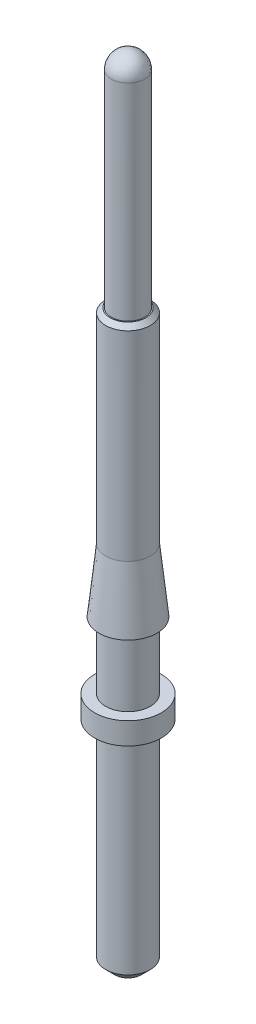
ISO-10303-21;
HEADER;
FILE_DESCRIPTION(('STEP AP214'),'2;1');
FILE_NAME('part.step','',(''),(''),'','','');
FILE_SCHEMA(('AUTOMOTIVE_DESIGN { 1 0 10303 214 1 1 1 1 }'));
ENDSEC;
DATA;
#1=APPLICATION_CONTEXT('core data for automotive mechanical design processes');
#2=APPLICATION_PROTOCOL_DEFINITION('international standard','automotive_design',2000,#1);
#3=PRODUCT_CONTEXT('',#1,'mechanical');
#4=PRODUCT('Part','Part','',(#3));
#5=PRODUCT_RELATED_PRODUCT_CATEGORY('part','',(#4));
#6=PRODUCT_DEFINITION_FORMATION('','',#4);
#7=PRODUCT_DEFINITION_CONTEXT('part definition',#1,'design');
#8=PRODUCT_DEFINITION('design','',#6,#7);
#9=PRODUCT_DEFINITION_SHAPE('','',#8);
#10=(LENGTH_UNIT() NAMED_UNIT(*) SI_UNIT(.MILLI.,.METRE.));
#11=(NAMED_UNIT(*) PLANE_ANGLE_UNIT() SI_UNIT($,.RADIAN.));
#12=(NAMED_UNIT(*) SI_UNIT($,.STERADIAN.) SOLID_ANGLE_UNIT());
#13=UNCERTAINTY_MEASURE_WITH_UNIT(LENGTH_MEASURE(1.E-05),#10,'distance_accuracy_value','');
#14=(GEOMETRIC_REPRESENTATION_CONTEXT(3) GLOBAL_UNCERTAINTY_ASSIGNED_CONTEXT((#13)) GLOBAL_UNIT_ASSIGNED_CONTEXT((#10,
#11,#12)) REPRESENTATION_CONTEXT('',''));
#15=CARTESIAN_POINT('',(0.,0.,0.));
#16=DIRECTION('',(0.,0.,1.));
#17=DIRECTION('',(1.,0.,0.));
#18=AXIS2_PLACEMENT_3D('',#15,#16,#17);
#19=CARTESIAN_POINT('',(0.,8.86,0.000500000000000093));
#20=DIRECTION('',(1.,0.,0.));
#21=DIRECTION('',(0.,0.,1.));
#22=AXIS2_PLACEMENT_3D('',#19,#20,#21);
#23=CIRCLE('',#22,0.19);
#24=TRIMMED_CURVE('',#23,(PARAMETER_VALUE(-1.57342790877965)),
(PARAMETER_VALUE(1.57342790877965)),.T.,.PARAMETER.);
#25=CARTESIAN_POINT('',(0.,8.86,0.));
#26=DIRECTION('',(0.,1.,0.));
#27=AXIS1_PLACEMENT('',#25,#26);
#28=SURFACE_OF_REVOLUTION('',#24,#27);
#29=CARTESIAN_POINT('',(0.,8.86,0.));
#30=DIRECTION('',(0.,-1.,0.));
#31=DIRECTION('',(0.,0.,-1.));
#32=AXIS2_PLACEMENT_3D('',#29,#30,#31);
#33=CIRCLE('',#32,0.1905);
#34=CARTESIAN_POINT('',(0.,8.86,-0.1905));
#35=VERTEX_POINT('',#34);
#36=EDGE_CURVE('E101',#35,#35,#33,.T.);
#37=ORIENTED_EDGE('',*,*,#36,.F.);
#38=EDGE_LOOP('',(#37));
#39=FACE_BOUND('',#38,.T.);
#40=CARTESIAN_POINT('',(0.,9.05,0.));
#41=VERTEX_POINT('',#40);
#42=VERTEX_LOOP('',#41);
#43=FACE_BOUND('',#42,.T.);
#44=ADVANCED_FACE('F17',(#39,#43),#28,.F.);
#45=CARTESIAN_POINT('',(0.,-0.868296699884766,0.));
#46=DIRECTION('',(0.,-1.,0.));
#47=DIRECTION('',(0.,0.,-1.));
#48=AXIS2_PLACEMENT_3D('',#45,#46,#47);
#49=CYLINDRICAL_SURFACE('',#48,0.1905);
#50=ORIENTED_EDGE('',*,*,#36,.T.);
#51=EDGE_LOOP('',(#50));
#52=FACE_BOUND('',#51,.T.);
#53=CARTESIAN_POINT('',(0.,6.51,0.));
#54=DIRECTION('',(0.,-1.,0.));
#55=DIRECTION('',(0.,0.,-1.));
#56=AXIS2_PLACEMENT_3D('',#53,#54,#55);
#57=CIRCLE('',#56,0.1905);
#58=CARTESIAN_POINT('',(0.,6.51,-0.1905));
#59=VERTEX_POINT('',#58);
#60=EDGE_CURVE('E21',#59,#59,#57,.T.);
#61=ORIENTED_EDGE('',*,*,#60,.F.);
#62=EDGE_LOOP('',(#61));
#63=FACE_BOUND('',#62,.T.);
#64=ADVANCED_FACE('F30',(#52,#63),#49,.T.);
#65=CARTESIAN_POINT('',(0.1905,6.51,0.));
#66=DIRECTION('',(0.,1.,0.));
#67=DIRECTION('',(0.,0.,1.));
#68=AXIS2_PLACEMENT_3D('',#65,#66,#67);
#69=PLANE('',#68);
#70=ORIENTED_EDGE('',*,*,#60,.T.);
#71=EDGE_LOOP('',(#70));
#72=FACE_BOUND('',#71,.T.);
#73=CARTESIAN_POINT('',(0.,6.50999999999158,0.));
#74=DIRECTION('',(0.,-1.,0.));
#75=DIRECTION('',(1.,0.,0.));
#76=AXIS2_PLACEMENT_3D('',#73,#74,#75);
#77=CIRCLE('',#76,0.203200000044035);
#78=CARTESIAN_POINT('',(0.203200000044035,6.50999999999158,0.));
#79=VERTEX_POINT('',#78);
#80=EDGE_CURVE('E96',#79,#79,#77,.T.);
#81=ORIENTED_EDGE('',*,*,#80,.F.);
#82=EDGE_LOOP('',(#81));
#83=FACE_BOUND('',#82,.T.);
#84=ADVANCED_FACE('F36',(#72,#83),#69,.T.);
#85=CARTESIAN_POINT('',(0.,6.45920000005162,0.));
#86=DIRECTION('',(0.,-1.,0.));
#87=DIRECTION('',(1.,0.,0.));
#88=AXIS2_PLACEMENT_3D('',#85,#86,#87);
#89=CONICAL_SURFACE('',#88,0.253999999927146,0.785398162837966);
#90=ORIENTED_EDGE('',*,*,#80,.T.);
#91=EDGE_LOOP('',(#90));
#92=FACE_BOUND('',#91,.T.);
#93=CARTESIAN_POINT('',(0.,6.4592,0.));
#94=DIRECTION('',(0.,-1.,0.));
#95=DIRECTION('',(0.,0.,-1.));
#96=AXIS2_PLACEMENT_3D('',#93,#94,#95);
#97=CIRCLE('',#96,0.254000000000002);
#98=CARTESIAN_POINT('',(0.,6.4592,-0.254000000000002));
#99=VERTEX_POINT('',#98);
#100=EDGE_CURVE('E97',#99,#99,#97,.T.);
#101=ORIENTED_EDGE('',*,*,#100,.F.);
#102=EDGE_LOOP('',(#101));
#103=FACE_BOUND('',#102,.T.);
#104=ADVANCED_FACE('F82',(#92,#103),#89,.T.);
#105=CARTESIAN_POINT('',(0.,-0.868296699884766,0.));
#106=DIRECTION('',(0.,-1.,0.));
#107=DIRECTION('',(0.,0.,-1.));
#108=AXIS2_PLACEMENT_3D('',#105,#106,#107);
#109=CYLINDRICAL_SURFACE('',#108,0.254000000000002);
#110=ORIENTED_EDGE('',*,*,#100,.T.);
#111=EDGE_LOOP('',(#110));
#112=FACE_BOUND('',#111,.T.);
#113=CARTESIAN_POINT('',(0.,4.18309169850772,0.));
#114=DIRECTION('',(0.,-1.,0.));
#115=DIRECTION('',(0.,0.,-1.));
#116=AXIS2_PLACEMENT_3D('',#113,#114,#115);
#117=CIRCLE('',#116,0.2539999999982);
#118=CARTESIAN_POINT('',(0.,4.18309169850772,-0.2539999999982));
#119=VERTEX_POINT('',#118);
#120=EDGE_CURVE('E99',#119,#119,#117,.T.);
#121=ORIENTED_EDGE('',*,*,#120,.F.);
#122=EDGE_LOOP('',(#121));
#123=FACE_BOUND('',#122,.T.);
#124=ADVANCED_FACE('F78',(#112,#123),#109,.T.);
#125=CARTESIAN_POINT('',(0.,3.46000000001823,0.));
#126=DIRECTION('',(0.,-1.,0.));
#127=DIRECTION('',(0.,0.,-1.));
#128=AXIS2_PLACEMENT_3D('',#125,#126,#127);
#129=CONICAL_SURFACE('',#128,0.329999999998165,0.104719755124129);
#130=ORIENTED_EDGE('',*,*,#120,.T.);
#131=EDGE_LOOP('',(#130));
#132=FACE_BOUND('',#131,.T.);
#133=CARTESIAN_POINT('',(0.,3.46000000001823,0.));
#134=DIRECTION('',(0.,-1.,0.));
#135=DIRECTION('',(0.,0.,-1.));
#136=AXIS2_PLACEMENT_3D('',#133,#134,#135);
#137=CIRCLE('',#136,0.329999999998165);
#138=CARTESIAN_POINT('',(0.,3.46000000001823,-0.329999999998165));
#139=VERTEX_POINT('',#138);
#140=EDGE_CURVE('E103',#139,#139,#137,.F.);
#141=ORIENTED_EDGE('',*,*,#140,.T.);
#142=EDGE_LOOP('',(#141));
#143=FACE_BOUND('',#142,.T.);
#144=ADVANCED_FACE('F74',(#132,#143),#129,.T.);
#145=CARTESIAN_POINT('',(0.,3.46,-0.330000000000001));
#146=DIRECTION('',(0.,1.,0.));
#147=DIRECTION('',(0.,0.,1.));
#148=AXIS2_PLACEMENT_3D('',#145,#146,#147);
#149=PLANE('',#148);
#150=CARTESIAN_POINT('',(0.,3.46,0.));
#151=DIRECTION('',(0.,-1.,0.));
#152=DIRECTION('',(0.,0.,-1.));
#153=AXIS2_PLACEMENT_3D('',#150,#151,#152);
#154=CIRCLE('',#153,0.254000000000002);
#155=CARTESIAN_POINT('',(0.,3.46,-0.254000000000002));
#156=VERTEX_POINT('',#155);
#157=EDGE_CURVE('E106',#156,#156,#154,.T.);
#158=ORIENTED_EDGE('',*,*,#157,.F.);
#159=EDGE_LOOP('',(#158));
#160=FACE_BOUND('',#159,.T.);
#161=ORIENTED_EDGE('',*,*,#140,.F.);
#162=EDGE_LOOP('',(#161));
#163=FACE_BOUND('',#162,.T.);
#164=ADVANCED_FACE('F70',(#160,#163),#149,.F.);
#165=CARTESIAN_POINT('',(0.,-0.868296699884766,0.));
#166=DIRECTION('',(0.,-1.,0.));
#167=DIRECTION('',(0.,0.,-1.));
#168=AXIS2_PLACEMENT_3D('',#165,#166,#167);
#169=CYLINDRICAL_SURFACE('',#168,0.254000000000002);
#170=ORIENTED_EDGE('',*,*,#157,.T.);
#171=EDGE_LOOP('',(#170));
#172=FACE_BOUND('',#171,.T.);
#173=CARTESIAN_POINT('',(0.,2.7,0.));
#174=DIRECTION('',(0.,-1.,0.));
#175=DIRECTION('',(0.,0.,-1.));
#176=AXIS2_PLACEMENT_3D('',#173,#174,#175);
#177=CIRCLE('',#176,0.254000000000002);
#178=CARTESIAN_POINT('',(0.,2.7,-0.254000000000002));
#179=VERTEX_POINT('',#178);
#180=EDGE_CURVE('E109',#179,#179,#177,.F.);
#181=ORIENTED_EDGE('',*,*,#180,.T.);
#182=EDGE_LOOP('',(#181));
#183=FACE_BOUND('',#182,.T.);
#184=ADVANCED_FACE('F66',(#172,#183),#169,.T.);
#185=CARTESIAN_POINT('',(0.,2.7,0.));
#186=DIRECTION('',(0.,-1.,0.));
#187=DIRECTION('',(0.,0.,-1.));
#188=AXIS2_PLACEMENT_3D('',#185,#186,#187);
#189=PLANE('',#188);
#190=CARTESIAN_POINT('',(0.,2.7,0.));
#191=DIRECTION('',(0.,1.,0.));
#192=DIRECTION('',(0.,0.,1.));
#193=AXIS2_PLACEMENT_3D('',#190,#191,#192);
#194=CIRCLE('',#193,0.380000000000001);
#195=CARTESIAN_POINT('',(0.,2.7,0.380000000000001));
#196=VERTEX_POINT('',#195);
#197=EDGE_CURVE('E112',#196,#196,#194,.F.);
#198=ORIENTED_EDGE('',*,*,#197,.F.);
#199=EDGE_LOOP('',(#198));
#200=FACE_BOUND('',#199,.T.);
#201=ORIENTED_EDGE('',*,*,#180,.F.);
#202=EDGE_LOOP('',(#201));
#203=FACE_BOUND('',#202,.T.);
#204=ADVANCED_FACE('F62',(#200,#203),#189,.F.);
#205=CARTESIAN_POINT('',(0.,10.9483329189675,0.));
#206=DIRECTION('',(0.,1.,0.));
#207=DIRECTION('',(0.,0.,1.));
#208=AXIS2_PLACEMENT_3D('',#205,#206,#207);
#209=CYLINDRICAL_SURFACE('',#208,0.380000000000001);
#210=ORIENTED_EDGE('',*,*,#197,.T.);
#211=EDGE_LOOP('',(#210));
#212=FACE_BOUND('',#211,.T.);
#213=CARTESIAN_POINT('',(0.,2.45,0.));
#214=DIRECTION('',(0.,1.,0.));
#215=DIRECTION('',(0.,0.,1.));
#216=AXIS2_PLACEMENT_3D('',#213,#214,#215);
#217=CIRCLE('',#216,0.380000000000001);
#218=CARTESIAN_POINT('',(0.,2.45,0.380000000000001));
#219=VERTEX_POINT('',#218);
#220=EDGE_CURVE('E115',#219,#219,#217,.T.);
#221=ORIENTED_EDGE('',*,*,#220,.T.);
#222=EDGE_LOOP('',(#221));
#223=FACE_BOUND('',#222,.T.);
#224=ADVANCED_FACE('F58',(#212,#223),#209,.T.);
#225=CARTESIAN_POINT('',(0.254000000000004,0.,0.));
#226=DIRECTION('',(0.,-1.,0.));
#227=DIRECTION('',(0.,0.,-1.));
#228=AXIS2_PLACEMENT_3D('',#225,#226,#227);
#229=PLANE('',#228);
#230=CARTESIAN_POINT('',(0.,-5.6843418860808E-11,0.));
#231=DIRECTION('',(0.,1.,0.));
#232=DIRECTION('',(-1.,0.,0.));
#233=AXIS2_PLACEMENT_3D('',#230,#231,#232);
#234=CIRCLE('',#233,0.15239999993355);
#235=CARTESIAN_POINT('',(-0.15239999993355,-5.68434147950499E-11,0.));
#236=VERTEX_POINT('',#235);
#237=EDGE_CURVE('E118',#236,#236,#234,.T.);
#238=ORIENTED_EDGE('',*,*,#237,.F.);
#239=EDGE_LOOP('',(#238));
#240=FACE_BOUND('',#239,.T.);
#241=ADVANCED_FACE('F54',(#240),#229,.T.);
#242=CARTESIAN_POINT('',(0.,2.45,0.));
#243=DIRECTION('',(0.,1.,0.));
#244=DIRECTION('',(0.,0.,1.));
#245=AXIS2_PLACEMENT_3D('',#242,#243,#244);
#246=PLANE('',#245);
#247=ORIENTED_EDGE('',*,*,#220,.F.);
#248=EDGE_LOOP('',(#247));
#249=FACE_BOUND('',#248,.T.);
#250=CARTESIAN_POINT('',(0.,2.45,0.));
#251=DIRECTION('',(0.,-1.,0.));
#252=DIRECTION('',(0.,0.,-1.));
#253=AXIS2_PLACEMENT_3D('',#250,#251,#252);
#254=CIRCLE('',#253,0.254000000000002);
#255=CARTESIAN_POINT('',(0.,2.45,-0.254000000000002));
#256=VERTEX_POINT('',#255);
#257=EDGE_CURVE('E25',#256,#256,#254,.T.);
#258=ORIENTED_EDGE('',*,*,#257,.F.);
#259=EDGE_LOOP('',(#258));
#260=FACE_BOUND('',#259,.T.);
#261=ADVANCED_FACE('F47',(#249,#260),#246,.F.);
#262=CARTESIAN_POINT('',(0.,0.101600000107283,0.));
#263=DIRECTION('',(0.,1.,0.));
#264=DIRECTION('',(-1.,0.,0.));
#265=AXIS2_PLACEMENT_3D('',#262,#263,#264);
#266=CONICAL_SURFACE('',#265,0.254000000097676,0.785398163397448);
#267=CARTESIAN_POINT('',(0.,0.101599999999999,0.));
#268=DIRECTION('',(0.,-1.,0.));
#269=DIRECTION('',(0.,0.,-1.));
#270=AXIS2_PLACEMENT_3D('',#267,#268,#269);
#271=CIRCLE('',#270,0.254000000000002);
#272=CARTESIAN_POINT('',(0.,0.101599999999999,-0.254000000000002));
#273=VERTEX_POINT('',#272);
#274=EDGE_CURVE('E11',#273,#273,#271,.F.);
#275=ORIENTED_EDGE('',*,*,#274,.F.);
#276=EDGE_LOOP('',(#275));
#277=FACE_BOUND('',#276,.T.);
#278=ORIENTED_EDGE('',*,*,#237,.T.);
#279=EDGE_LOOP('',(#278));
#280=FACE_BOUND('',#279,.T.);
#281=ADVANCED_FACE('F41',(#277,#280),#266,.T.);
#282=CARTESIAN_POINT('',(0.,-0.868296699884766,0.));
#283=DIRECTION('',(0.,-1.,0.));
#284=DIRECTION('',(0.,0.,-1.));
#285=AXIS2_PLACEMENT_3D('',#282,#283,#284);
#286=CYLINDRICAL_SURFACE('',#285,0.254000000000002);
#287=ORIENTED_EDGE('',*,*,#274,.T.);
#288=EDGE_LOOP('',(#287));
#289=FACE_BOUND('',#288,.T.);
#290=ORIENTED_EDGE('',*,*,#257,.T.);
#291=EDGE_LOOP('',(#290));
#292=FACE_BOUND('',#291,.T.);
#293=ADVANCED_FACE('F39',(#289,#292),#286,.T.);
#294=CLOSED_SHELL('',(#44,#64,#84,#104,#124,#144,#164,#184,#204,#224,#241,#261,#281,#293));
#295=MANIFOLD_SOLID_BREP('B1',#294);
#296=ADVANCED_BREP_SHAPE_REPRESENTATION('',(#18,#295),#14);
#297=SHAPE_DEFINITION_REPRESENTATION(#9,#296);
ENDSEC;
END-ISO-10303-21;
